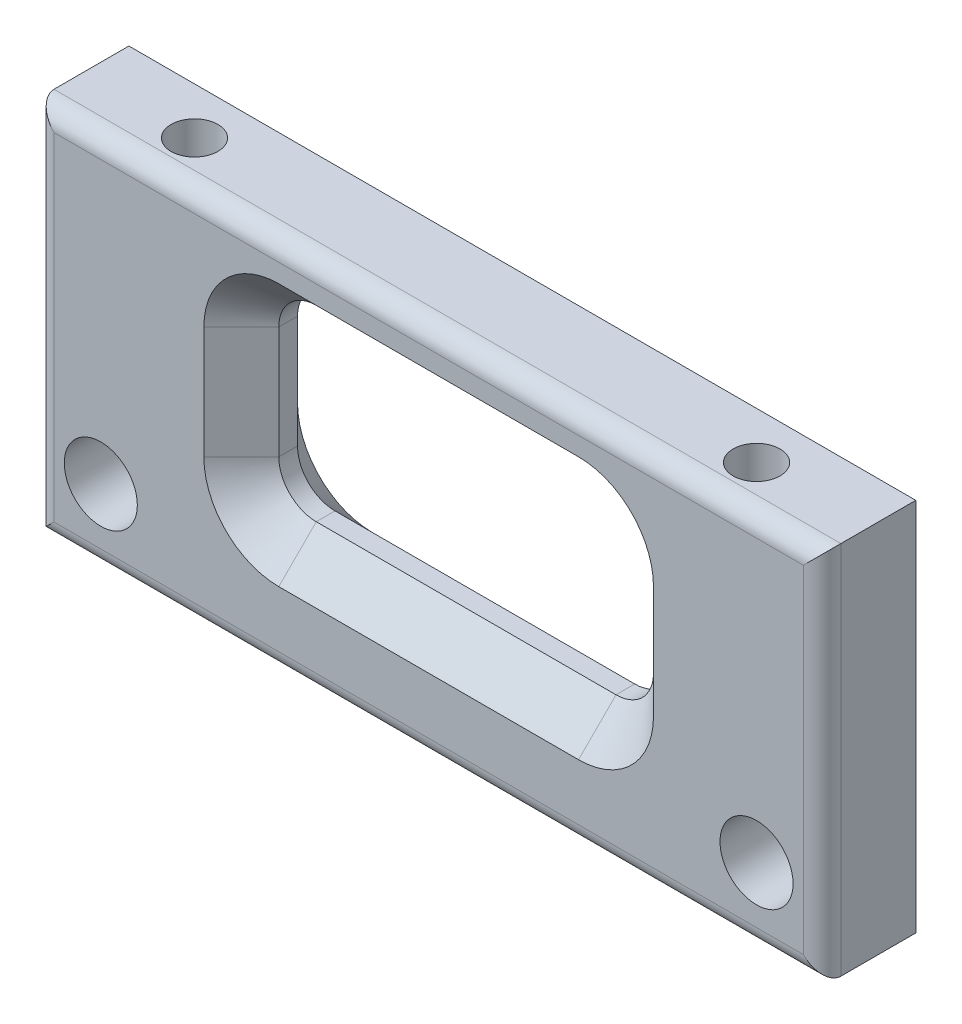
ISO-10303-21;
HEADER;
FILE_DESCRIPTION(('STEP AP214'),'2;1');
FILE_NAME('part.step','',(''),(''),'','','');
FILE_SCHEMA(('AUTOMOTIVE_DESIGN { 1 0 10303 214 1 1 1 1 }'));
ENDSEC;
DATA;
#1=APPLICATION_CONTEXT('core data for automotive mechanical design processes');
#2=APPLICATION_PROTOCOL_DEFINITION('international standard','automotive_design',2000,#1);
#3=PRODUCT_CONTEXT('',#1,'mechanical');
#4=PRODUCT('Part','Part','',(#3));
#5=PRODUCT_RELATED_PRODUCT_CATEGORY('part','',(#4));
#6=PRODUCT_DEFINITION_FORMATION('','',#4);
#7=PRODUCT_DEFINITION_CONTEXT('part definition',#1,'design');
#8=PRODUCT_DEFINITION('design','',#6,#7);
#9=PRODUCT_DEFINITION_SHAPE('','',#8);
#10=(LENGTH_UNIT() NAMED_UNIT(*) SI_UNIT(.MILLI.,.METRE.));
#11=(NAMED_UNIT(*) PLANE_ANGLE_UNIT() SI_UNIT($,.RADIAN.));
#12=(NAMED_UNIT(*) SI_UNIT($,.STERADIAN.) SOLID_ANGLE_UNIT());
#13=UNCERTAINTY_MEASURE_WITH_UNIT(LENGTH_MEASURE(1.E-05),#10,'distance_accuracy_value','');
#14=(GEOMETRIC_REPRESENTATION_CONTEXT(3) GLOBAL_UNCERTAINTY_ASSIGNED_CONTEXT((#13)) GLOBAL_UNIT_ASSIGNED_CONTEXT((#10,
#11,#12)) REPRESENTATION_CONTEXT('',''));
#15=CARTESIAN_POINT('',(0.,0.,0.));
#16=DIRECTION('',(0.,0.,1.));
#17=DIRECTION('',(1.,0.,0.));
#18=AXIS2_PLACEMENT_3D('',#15,#16,#17);
#19=CARTESIAN_POINT('',(0.,0.,5.));
#20=DIRECTION('',(0.,0.,1.));
#21=DIRECTION('',(1.,0.,0.));
#22=AXIS2_PLACEMENT_3D('',#19,#20,#21);
#23=PLANE('',#22);
#24=CARTESIAN_POINT('',(13.,-5.9903461742617,5.));
#25=DIRECTION('',(0.,0.,1.));
#26=DIRECTION('',(1.,0.,0.));
#27=AXIS2_PLACEMENT_3D('',#24,#25,#26);
#28=CIRCLE('',#27,4.00000000000001);
#29=CARTESIAN_POINT('',(8.99999999999999,-5.99034617426173,5.));
#30=VERTEX_POINT('',#29);
#31=CARTESIAN_POINT('',(13.,-1.99034617426169,5.));
#32=VERTEX_POINT('',#31);
#33=EDGE_CURVE('E50',#30,#32,#28,.F.);
#34=ORIENTED_EDGE('',*,*,#33,.T.);
#35=DIRECTION('',(1.,0.,0.));
#36=VECTOR('',#35,1.);
#37=CARTESIAN_POINT('',(29.,-1.99034617426169,5.));
#38=LINE('',#37,#36);
#39=CARTESIAN_POINT('',(29.,-1.99034617426169,5.));
#40=VERTEX_POINT('',#39);
#41=EDGE_CURVE('E11',#32,#40,#38,.T.);
#42=ORIENTED_EDGE('',*,*,#41,.T.);
#43=CARTESIAN_POINT('',(29.,-5.9903461742617,5.));
#44=DIRECTION('',(0.,0.,1.));
#45=DIRECTION('',(1.,0.,0.));
#46=AXIS2_PLACEMENT_3D('',#43,#44,#45);
#47=CIRCLE('',#46,4.00000000000001);
#48=CARTESIAN_POINT('',(33.,-5.99034617426172,5.));
#49=VERTEX_POINT('',#48);
#50=EDGE_CURVE('E322',#40,#49,#47,.F.);
#51=ORIENTED_EDGE('',*,*,#50,.T.);
#52=DIRECTION('',(0.,-1.,0.));
#53=VECTOR('',#52,1.);
#54=CARTESIAN_POINT('',(33.,-11.9903461742617,5.));
#55=LINE('',#54,#53);
#56=CARTESIAN_POINT('',(33.,-11.9903461742617,5.));
#57=VERTEX_POINT('',#56);
#58=EDGE_CURVE('E318',#49,#57,#55,.T.);
#59=ORIENTED_EDGE('',*,*,#58,.T.);
#60=CARTESIAN_POINT('',(29.,-11.9903461742617,5.));
#61=DIRECTION('',(0.,0.,1.));
#62=DIRECTION('',(1.,0.,0.));
#63=AXIS2_PLACEMENT_3D('',#60,#61,#62);
#64=CIRCLE('',#63,4.00000000000001);
#65=CARTESIAN_POINT('',(29.,-15.9903461742617,5.));
#66=VERTEX_POINT('',#65);
#67=EDGE_CURVE('E314',#57,#66,#64,.F.);
#68=ORIENTED_EDGE('',*,*,#67,.T.);
#69=DIRECTION('',(-1.,0.,0.));
#70=VECTOR('',#69,1.);
#71=CARTESIAN_POINT('',(13.,-15.9903461742617,5.));
#72=LINE('',#71,#70);
#73=CARTESIAN_POINT('',(13.,-15.9903461742617,5.));
#74=VERTEX_POINT('',#73);
#75=EDGE_CURVE('E312',#66,#74,#72,.T.);
#76=ORIENTED_EDGE('',*,*,#75,.T.);
#77=CARTESIAN_POINT('',(13.,-11.9903461742617,5.));
#78=DIRECTION('',(0.,0.,1.));
#79=DIRECTION('',(1.,0.,0.));
#80=AXIS2_PLACEMENT_3D('',#77,#78,#79);
#81=CIRCLE('',#80,4.00000000000001);
#82=CARTESIAN_POINT('',(8.99999999999999,-11.9903461742617,5.));
#83=VERTEX_POINT('',#82);
#84=EDGE_CURVE('E316',#74,#83,#81,.F.);
#85=ORIENTED_EDGE('',*,*,#84,.T.);
#86=DIRECTION('',(0.,1.,0.));
#87=VECTOR('',#86,1.);
#88=CARTESIAN_POINT('',(8.99999999999999,-5.99034617426171,5.));
#89=LINE('',#88,#87);
#90=EDGE_CURVE('E320',#83,#30,#89,.T.);
#91=ORIENTED_EDGE('',*,*,#90,.T.);
#92=EDGE_LOOP('',(#34,#42,#51,#59,#68,#76,#85,#91));
#93=FACE_BOUND('',#92,.T.);
#94=DIRECTION('',(1.,0.,0.));
#95=VECTOR('',#94,1.);
#96=CARTESIAN_POINT('',(42.,-19.,5.));
#97=LINE('',#96,#95);
#98=CARTESIAN_POINT('',(1.,-19.,5.));
#99=VERTEX_POINT('',#98);
#100=CARTESIAN_POINT('',(41.,-19.,5.));
#101=VERTEX_POINT('',#100);
#102=EDGE_CURVE('E203',#99,#101,#97,.T.);
#103=ORIENTED_EDGE('',*,*,#102,.T.);
#104=DIRECTION('',(0.,1.,0.));
#105=VECTOR('',#104,1.);
#106=CARTESIAN_POINT('',(41.,0.,5.));
#107=LINE('',#106,#105);
#108=CARTESIAN_POINT('',(41.,-1.,5.));
#109=VERTEX_POINT('',#108);
#110=EDGE_CURVE('E238',#101,#109,#107,.T.);
#111=ORIENTED_EDGE('',*,*,#110,.T.);
#112=DIRECTION('',(-1.,0.,0.));
#113=VECTOR('',#112,1.);
#114=CARTESIAN_POINT('',(0.,-1.,5.));
#115=LINE('',#114,#113);
#116=CARTESIAN_POINT('',(1.,-1.,5.));
#117=VERTEX_POINT('',#116);
#118=EDGE_CURVE('E236',#109,#117,#115,.T.);
#119=ORIENTED_EDGE('',*,*,#118,.T.);
#120=DIRECTION('',(0.,-1.,0.));
#121=VECTOR('',#120,1.);
#122=CARTESIAN_POINT('',(1.,-20.,5.));
#123=LINE('',#122,#121);
#124=EDGE_CURVE('E234',#117,#99,#123,.T.);
#125=ORIENTED_EDGE('',*,*,#124,.T.);
#126=EDGE_LOOP('',(#103,#111,#119,#125));
#127=FACE_BOUND('',#126,.T.);
#128=CARTESIAN_POINT('',(3.5,-16.,5.));
#129=DIRECTION('',(0.,0.,1.));
#130=DIRECTION('',(1.,0.,0.));
#131=AXIS2_PLACEMENT_3D('',#128,#129,#130);
#132=CIRCLE('',#131,1.95);
#133=CARTESIAN_POINT('',(5.45,-16.,5.));
#134=VERTEX_POINT('',#133);
#135=EDGE_CURVE('E219',#134,#134,#132,.T.);
#136=ORIENTED_EDGE('',*,*,#135,.F.);
#137=EDGE_LOOP('',(#136));
#138=FACE_BOUND('',#137,.T.);
#139=CARTESIAN_POINT('',(38.5,-16.,5.));
#140=DIRECTION('',(0.,0.,1.));
#141=DIRECTION('',(1.,0.,0.));
#142=AXIS2_PLACEMENT_3D('',#139,#140,#141);
#143=CIRCLE('',#142,1.95);
#144=CARTESIAN_POINT('',(40.45,-16.,5.));
#145=VERTEX_POINT('',#144);
#146=EDGE_CURVE('E428',#145,#145,#143,.T.);
#147=ORIENTED_EDGE('',*,*,#146,.F.);
#148=EDGE_LOOP('',(#147));
#149=FACE_BOUND('',#148,.T.);
#150=ADVANCED_FACE('F40',(#93,#127,#138,#149),#23,.T.);
#151=CARTESIAN_POINT('',(0.,0.,0.));
#152=DIRECTION('',(0.,0.,1.));
#153=DIRECTION('',(1.,0.,0.));
#154=AXIS2_PLACEMENT_3D('',#151,#152,#153);
#155=PLANE('',#154);
#156=CARTESIAN_POINT('',(29.,-5.9903461742617,0.));
#157=DIRECTION('',(0.,0.,1.));
#158=DIRECTION('',(1.,0.,0.));
#159=AXIS2_PLACEMENT_3D('',#156,#157,#158);
#160=CIRCLE('',#159,3.99999999999999);
#161=CARTESIAN_POINT('',(33.,-5.99034617426172,0.));
#162=VERTEX_POINT('',#161);
#163=CARTESIAN_POINT('',(29.,-1.9903461742617,0.));
#164=VERTEX_POINT('',#163);
#165=EDGE_CURVE('E271',#162,#164,#160,.T.);
#166=ORIENTED_EDGE('',*,*,#165,.T.);
#167=DIRECTION('',(-1.,0.,0.));
#168=VECTOR('',#167,1.);
#169=CARTESIAN_POINT('',(0.,-1.9903461742617,0.));
#170=LINE('',#169,#168);
#171=CARTESIAN_POINT('',(13.,-1.9903461742617,0.));
#172=VERTEX_POINT('',#171);
#173=EDGE_CURVE('E275',#164,#172,#170,.T.);
#174=ORIENTED_EDGE('',*,*,#173,.T.);
#175=CARTESIAN_POINT('',(13.,-5.9903461742617,0.));
#176=DIRECTION('',(0.,0.,1.));
#177=DIRECTION('',(1.,0.,0.));
#178=AXIS2_PLACEMENT_3D('',#175,#176,#177);
#179=CIRCLE('',#178,3.99999999999999);
#180=CARTESIAN_POINT('',(9.00000000000001,-5.99034617426173,0.));
#181=VERTEX_POINT('',#180);
#182=EDGE_CURVE('E273',#172,#181,#179,.T.);
#183=ORIENTED_EDGE('',*,*,#182,.T.);
#184=DIRECTION('',(0.,-1.,0.));
#185=VECTOR('',#184,1.);
#186=CARTESIAN_POINT('',(9.00000000000001,0.,0.));
#187=LINE('',#186,#185);
#188=CARTESIAN_POINT('',(9.,-11.9903461742617,0.));
#189=VERTEX_POINT('',#188);
#190=EDGE_CURVE('E269',#181,#189,#187,.T.);
#191=ORIENTED_EDGE('',*,*,#190,.T.);
#192=CARTESIAN_POINT('',(13.,-11.9903461742617,0.));
#193=DIRECTION('',(0.,0.,1.));
#194=DIRECTION('',(1.,0.,0.));
#195=AXIS2_PLACEMENT_3D('',#192,#193,#194);
#196=CIRCLE('',#195,4.);
#197=CARTESIAN_POINT('',(13.,-15.9903461742617,0.));
#198=VERTEX_POINT('',#197);
#199=EDGE_CURVE('E265',#189,#198,#196,.T.);
#200=ORIENTED_EDGE('',*,*,#199,.T.);
#201=DIRECTION('',(1.,0.,0.));
#202=VECTOR('',#201,1.);
#203=CARTESIAN_POINT('',(0.,-15.9903461742617,0.));
#204=LINE('',#203,#202);
#205=CARTESIAN_POINT('',(29.,-15.9903461742617,0.));
#206=VERTEX_POINT('',#205);
#207=EDGE_CURVE('E249',#198,#206,#204,.T.);
#208=ORIENTED_EDGE('',*,*,#207,.T.);
#209=CARTESIAN_POINT('',(29.,-11.9903461742617,0.));
#210=DIRECTION('',(0.,0.,1.));
#211=DIRECTION('',(1.,0.,0.));
#212=AXIS2_PLACEMENT_3D('',#209,#210,#211);
#213=CIRCLE('',#212,4.);
#214=CARTESIAN_POINT('',(33.,-11.9903461742617,0.));
#215=VERTEX_POINT('',#214);
#216=EDGE_CURVE('E263',#206,#215,#213,.T.);
#217=ORIENTED_EDGE('',*,*,#216,.T.);
#218=DIRECTION('',(0.,1.,0.));
#219=VECTOR('',#218,1.);
#220=CARTESIAN_POINT('',(33.,0.,0.));
#221=LINE('',#220,#219);
#222=EDGE_CURVE('E267',#215,#162,#221,.T.);
#223=ORIENTED_EDGE('',*,*,#222,.T.);
#224=EDGE_LOOP('',(#166,#174,#183,#191,#200,#208,#217,#223));
#225=FACE_BOUND('',#224,.T.);
#226=DIRECTION('',(0.,-1.,0.));
#227=VECTOR('',#226,1.);
#228=CARTESIAN_POINT('',(0.,0.,0.));
#229=LINE('',#228,#227);
#230=CARTESIAN_POINT('',(0.,0.,0.));
#231=VERTEX_POINT('',#230);
#232=CARTESIAN_POINT('',(0.,-20.,0.));
#233=VERTEX_POINT('',#232);
#234=EDGE_CURVE('E211',#231,#233,#229,.T.);
#235=ORIENTED_EDGE('',*,*,#234,.F.);
#236=DIRECTION('',(-1.,0.,0.));
#237=VECTOR('',#236,1.);
#238=CARTESIAN_POINT('',(0.,0.,0.));
#239=LINE('',#238,#237);
#240=CARTESIAN_POINT('',(42.,0.,0.));
#241=VERTEX_POINT('',#240);
#242=EDGE_CURVE('E227',#241,#231,#239,.T.);
#243=ORIENTED_EDGE('',*,*,#242,.F.);
#244=DIRECTION('',(0.,1.,0.));
#245=VECTOR('',#244,1.);
#246=CARTESIAN_POINT('',(42.,0.,0.));
#247=LINE('',#246,#245);
#248=CARTESIAN_POINT('',(42.,-20.,0.));
#249=VERTEX_POINT('',#248);
#250=EDGE_CURVE('E213',#249,#241,#247,.T.);
#251=ORIENTED_EDGE('',*,*,#250,.F.);
#252=DIRECTION('',(1.,0.,0.));
#253=VECTOR('',#252,1.);
#254=CARTESIAN_POINT('',(0.,-20.,0.));
#255=LINE('',#254,#253);
#256=EDGE_CURVE('E196',#233,#249,#255,.T.);
#257=ORIENTED_EDGE('',*,*,#256,.F.);
#258=EDGE_LOOP('',(#235,#243,#251,#257));
#259=FACE_BOUND('',#258,.T.);
#260=CARTESIAN_POINT('',(3.5,-16.,0.));
#261=DIRECTION('',(0.,0.,1.));
#262=DIRECTION('',(1.,0.,0.));
#263=AXIS2_PLACEMENT_3D('',#260,#261,#262);
#264=CIRCLE('',#263,1.95);
#265=CARTESIAN_POINT('',(5.45,-16.,0.));
#266=VERTEX_POINT('',#265);
#267=EDGE_CURVE('E222',#266,#266,#264,.T.);
#268=ORIENTED_EDGE('',*,*,#267,.T.);
#269=EDGE_LOOP('',(#268));
#270=FACE_BOUND('',#269,.T.);
#271=CARTESIAN_POINT('',(38.5,-16.,0.));
#272=DIRECTION('',(0.,0.,1.));
#273=DIRECTION('',(1.,0.,0.));
#274=AXIS2_PLACEMENT_3D('',#271,#272,#273);
#275=CIRCLE('',#274,1.95);
#276=CARTESIAN_POINT('',(40.45,-16.,0.));
#277=VERTEX_POINT('',#276);
#278=EDGE_CURVE('E417',#277,#277,#275,.T.);
#279=ORIENTED_EDGE('',*,*,#278,.T.);
#280=EDGE_LOOP('',(#279));
#281=FACE_BOUND('',#280,.T.);
#282=ADVANCED_FACE('F208',(#225,#259,#270,#281),#155,.F.);
#283=CARTESIAN_POINT('',(0.,0.,5.));
#284=DIRECTION('',(1.,0.,0.));
#285=DIRECTION('',(0.,1.,0.));
#286=AXIS2_PLACEMENT_3D('',#283,#284,#285);
#287=PLANE('',#286);
#288=DIRECTION('',(0.,0.,-1.));
#289=VECTOR('',#288,1.);
#290=CARTESIAN_POINT('',(0.,-20.,5.));
#291=LINE('',#290,#289);
#292=CARTESIAN_POINT('',(0.,-20.,4.));
#293=VERTEX_POINT('',#292);
#294=EDGE_CURVE('E192',#293,#233,#291,.T.);
#295=ORIENTED_EDGE('',*,*,#294,.F.);
#296=DIRECTION('',(0.,-1.,0.));
#297=VECTOR('',#296,1.);
#298=CARTESIAN_POINT('',(0.,0.,4.));
#299=LINE('',#298,#297);
#300=CARTESIAN_POINT('',(0.,0.,4.));
#301=VERTEX_POINT('',#300);
#302=EDGE_CURVE('E246',#293,#301,#299,.F.);
#303=ORIENTED_EDGE('',*,*,#302,.T.);
#304=DIRECTION('',(0.,0.,-1.));
#305=VECTOR('',#304,1.);
#306=CARTESIAN_POINT('',(0.,0.,5.));
#307=LINE('',#306,#305);
#308=EDGE_CURVE('E217',#301,#231,#307,.T.);
#309=ORIENTED_EDGE('',*,*,#308,.T.);
#310=ORIENTED_EDGE('',*,*,#234,.T.);
#311=EDGE_LOOP('',(#295,#303,#309,#310));
#312=FACE_BOUND('',#311,.T.);
#313=ADVANCED_FACE('F215',(#312),#287,.F.);
#314=CARTESIAN_POINT('',(0.,-20.,5.));
#315=DIRECTION('',(0.,1.,0.));
#316=DIRECTION('',(0.,0.,1.));
#317=AXIS2_PLACEMENT_3D('',#314,#315,#316);
#318=PLANE('',#317);
#319=DIRECTION('',(0.,0.,-1.));
#320=VECTOR('',#319,1.);
#321=CARTESIAN_POINT('',(42.,-20.,5.));
#322=LINE('',#321,#320);
#323=CARTESIAN_POINT('',(42.,-20.,4.));
#324=VERTEX_POINT('',#323);
#325=EDGE_CURVE('E204',#324,#249,#322,.T.);
#326=ORIENTED_EDGE('',*,*,#325,.F.);
#327=DIRECTION('',(1.,0.,0.));
#328=VECTOR('',#327,1.);
#329=CARTESIAN_POINT('',(0.,-20.,4.));
#330=LINE('',#329,#328);
#331=EDGE_CURVE('E199',#324,#293,#330,.F.);
#332=ORIENTED_EDGE('',*,*,#331,.T.);
#333=ORIENTED_EDGE('',*,*,#294,.T.);
#334=ORIENTED_EDGE('',*,*,#256,.T.);
#335=EDGE_LOOP('',(#326,#332,#333,#334));
#336=FACE_BOUND('',#335,.T.);
#337=ADVANCED_FACE('F195',(#336),#318,.F.);
#338=CARTESIAN_POINT('',(42.,0.,5.));
#339=DIRECTION('',(-1.,0.,0.));
#340=DIRECTION('',(0.,0.,1.));
#341=AXIS2_PLACEMENT_3D('',#338,#339,#340);
#342=PLANE('',#341);
#343=DIRECTION('',(0.,0.,-1.));
#344=VECTOR('',#343,1.);
#345=CARTESIAN_POINT('',(42.,0.,5.));
#346=LINE('',#345,#344);
#347=CARTESIAN_POINT('',(42.,0.,4.));
#348=VERTEX_POINT('',#347);
#349=EDGE_CURVE('E230',#348,#241,#346,.T.);
#350=ORIENTED_EDGE('',*,*,#349,.F.);
#351=DIRECTION('',(0.,1.,0.));
#352=VECTOR('',#351,1.);
#353=CARTESIAN_POINT('',(42.,-20.,4.));
#354=LINE('',#353,#352);
#355=EDGE_CURVE('E241',#348,#324,#354,.F.);
#356=ORIENTED_EDGE('',*,*,#355,.T.);
#357=ORIENTED_EDGE('',*,*,#325,.T.);
#358=ORIENTED_EDGE('',*,*,#250,.T.);
#359=EDGE_LOOP('',(#350,#356,#357,#358));
#360=FACE_BOUND('',#359,.T.);
#361=ADVANCED_FACE('F462',(#360),#342,.F.);
#362=CARTESIAN_POINT('',(0.,0.,5.));
#363=DIRECTION('',(0.,-1.,0.));
#364=DIRECTION('',(0.,0.,-1.));
#365=AXIS2_PLACEMENT_3D('',#362,#363,#364);
#366=PLANE('',#365);
#367=CARTESIAN_POINT('',(36.,0.,2.5));
#368=DIRECTION('',(0.,1.,0.));
#369=DIRECTION('',(0.,0.,1.));
#370=AXIS2_PLACEMENT_3D('',#367,#368,#369);
#371=CIRCLE('',#370,1.25);
#372=CARTESIAN_POINT('',(36.,0.,3.75));
#373=VERTEX_POINT('',#372);
#374=EDGE_CURVE('E418',#373,#373,#371,.T.);
#375=ORIENTED_EDGE('',*,*,#374,.F.);
#376=EDGE_LOOP('',(#375));
#377=FACE_BOUND('',#376,.T.);
#378=CARTESIAN_POINT('',(6.,0.,2.5));
#379=DIRECTION('',(0.,1.,0.));
#380=DIRECTION('',(0.,0.,1.));
#381=AXIS2_PLACEMENT_3D('',#378,#379,#380);
#382=CIRCLE('',#381,1.25);
#383=CARTESIAN_POINT('',(6.,0.,3.75));
#384=VERTEX_POINT('',#383);
#385=EDGE_CURVE('E421',#384,#384,#382,.T.);
#386=ORIENTED_EDGE('',*,*,#385,.F.);
#387=EDGE_LOOP('',(#386));
#388=FACE_BOUND('',#387,.T.);
#389=ORIENTED_EDGE('',*,*,#308,.F.);
#390=DIRECTION('',(-1.,0.,0.));
#391=VECTOR('',#390,1.);
#392=CARTESIAN_POINT('',(42.,0.,4.));
#393=LINE('',#392,#391);
#394=EDGE_CURVE('E244',#301,#348,#393,.F.);
#395=ORIENTED_EDGE('',*,*,#394,.T.);
#396=ORIENTED_EDGE('',*,*,#349,.T.);
#397=ORIENTED_EDGE('',*,*,#242,.T.);
#398=EDGE_LOOP('',(#389,#395,#396,#397));
#399=FACE_BOUND('',#398,.T.);
#400=ADVANCED_FACE('F448',(#377,#388,#399),#366,.F.);
#401=CARTESIAN_POINT('',(3.5,-16.,5.));
#402=DIRECTION('',(0.,0.,-1.));
#403=DIRECTION('',(-1.,0.,0.));
#404=AXIS2_PLACEMENT_3D('',#401,#402,#403);
#405=CYLINDRICAL_SURFACE('',#404,1.95);
#406=ORIENTED_EDGE('',*,*,#135,.T.);
#407=EDGE_LOOP('',(#406));
#408=FACE_BOUND('',#407,.T.);
#409=ORIENTED_EDGE('',*,*,#267,.F.);
#410=EDGE_LOOP('',(#409));
#411=FACE_BOUND('',#410,.T.);
#412=ADVANCED_FACE('F438',(#408,#411),#405,.F.);
#413=CARTESIAN_POINT('',(38.5,-16.,5.));
#414=DIRECTION('',(0.,0.,-1.));
#415=DIRECTION('',(-1.,0.,0.));
#416=AXIS2_PLACEMENT_3D('',#413,#414,#415);
#417=CYLINDRICAL_SURFACE('',#416,1.95);
#418=ORIENTED_EDGE('',*,*,#146,.T.);
#419=EDGE_LOOP('',(#418));
#420=FACE_BOUND('',#419,.T.);
#421=ORIENTED_EDGE('',*,*,#278,.F.);
#422=EDGE_LOOP('',(#421));
#423=FACE_BOUND('',#422,.T.);
#424=ADVANCED_FACE('F435',(#420,#423),#417,.F.);
#425=CARTESIAN_POINT('',(6.,-10.,2.5));
#426=DIRECTION('',(0.,1.,0.));
#427=DIRECTION('',(0.,0.,1.));
#428=AXIS2_PLACEMENT_3D('',#425,#426,#427);
#429=CYLINDRICAL_SURFACE('',#428,1.25);
#430=CARTESIAN_POINT('',(6.,-10.,2.5));
#431=DIRECTION('',(0.,1.,0.));
#432=DIRECTION('',(0.,0.,1.));
#433=AXIS2_PLACEMENT_3D('',#430,#431,#432);
#434=CIRCLE('',#433,1.25);
#435=CARTESIAN_POINT('',(6.,-10.,3.75));
#436=VERTEX_POINT('',#435);
#437=EDGE_CURVE('E424',#436,#436,#434,.T.);
#438=ORIENTED_EDGE('',*,*,#437,.F.);
#439=EDGE_LOOP('',(#438));
#440=FACE_BOUND('',#439,.T.);
#441=ORIENTED_EDGE('',*,*,#385,.T.);
#442=EDGE_LOOP('',(#441));
#443=FACE_BOUND('',#442,.T.);
#444=ADVANCED_FACE('F437',(#440,#443),#429,.F.);
#445=CARTESIAN_POINT('',(6.,-10.,2.5));
#446=DIRECTION('',(0.,1.,0.));
#447=DIRECTION('',(0.,0.,1.));
#448=AXIS2_PLACEMENT_3D('',#445,#446,#447);
#449=PLANE('',#448);
#450=ORIENTED_EDGE('',*,*,#437,.T.);
#451=EDGE_LOOP('',(#450));
#452=FACE_BOUND('',#451,.T.);
#453=ADVANCED_FACE('F445',(#452),#449,.T.);
#454=CARTESIAN_POINT('',(36.,-10.,2.5));
#455=DIRECTION('',(0.,1.,0.));
#456=DIRECTION('',(0.,0.,1.));
#457=AXIS2_PLACEMENT_3D('',#454,#455,#456);
#458=CYLINDRICAL_SURFACE('',#457,1.25);
#459=CARTESIAN_POINT('',(36.,-10.,2.5));
#460=DIRECTION('',(0.,1.,0.));
#461=DIRECTION('',(0.,0.,1.));
#462=AXIS2_PLACEMENT_3D('',#459,#460,#461);
#463=CIRCLE('',#462,1.25);
#464=CARTESIAN_POINT('',(36.,-10.,3.75));
#465=VERTEX_POINT('',#464);
#466=EDGE_CURVE('E414',#465,#465,#463,.T.);
#467=ORIENTED_EDGE('',*,*,#466,.F.);
#468=EDGE_LOOP('',(#467));
#469=FACE_BOUND('',#468,.T.);
#470=ORIENTED_EDGE('',*,*,#374,.T.);
#471=EDGE_LOOP('',(#470));
#472=FACE_BOUND('',#471,.T.);
#473=ADVANCED_FACE('F704',(#469,#472),#458,.F.);
#474=CARTESIAN_POINT('',(36.,-10.,2.5));
#475=DIRECTION('',(0.,1.,0.));
#476=DIRECTION('',(0.,0.,1.));
#477=AXIS2_PLACEMENT_3D('',#474,#475,#476);
#478=PLANE('',#477);
#479=ORIENTED_EDGE('',*,*,#466,.T.);
#480=EDGE_LOOP('',(#479));
#481=FACE_BOUND('',#480,.T.);
#482=ADVANCED_FACE('F695',(#481),#478,.T.);
#483=CARTESIAN_POINT('',(13.,-11.9903461742617,-5.));
#484=DIRECTION('',(0.,0.,1.));
#485=DIRECTION('',(1.,0.,0.));
#486=AXIS2_PLACEMENT_3D('',#483,#484,#485);
#487=CYLINDRICAL_SURFACE('',#486,2.);
#488=DIRECTION('',(0.,0.,1.));
#489=VECTOR('',#488,1.);
#490=CARTESIAN_POINT('',(13.,-13.9903461742617,-5.));
#491=LINE('',#490,#489);
#492=CARTESIAN_POINT('',(13.,-13.9903461742617,2.00000000000001));
#493=VERTEX_POINT('',#492);
#494=CARTESIAN_POINT('',(13.,-13.9903461742617,3.00000000000001));
#495=VERTEX_POINT('',#494);
#496=EDGE_CURVE('E261',#493,#495,#491,.T.);
#497=ORIENTED_EDGE('',*,*,#496,.F.);
#498=CARTESIAN_POINT('',(13.,-11.9903461742617,2.00000000000001));
#499=DIRECTION('',(0.,0.,1.));
#500=DIRECTION('',(1.,0.,0.));
#501=AXIS2_PLACEMENT_3D('',#498,#499,#500);
#502=CIRCLE('',#501,2.);
#503=CARTESIAN_POINT('',(11.,-11.9903461742617,2.00000000000001));
#504=VERTEX_POINT('',#503);
#505=EDGE_CURVE('E302',#493,#504,#502,.F.);
#506=ORIENTED_EDGE('',*,*,#505,.T.);
#507=DIRECTION('',(0.,0.,1.));
#508=VECTOR('',#507,1.);
#509=CARTESIAN_POINT('',(11.,-11.9903461742617,-5.));
#510=LINE('',#509,#508);
#511=CARTESIAN_POINT('',(11.,-11.9903461742617,3.00000000000001));
#512=VERTEX_POINT('',#511);
#513=EDGE_CURVE('E427',#504,#512,#510,.T.);
#514=ORIENTED_EDGE('',*,*,#513,.T.);
#515=CARTESIAN_POINT('',(13.,-11.9903461742617,3.00000000000001));
#516=DIRECTION('',(0.,0.,1.));
#517=DIRECTION('',(1.,0.,0.));
#518=AXIS2_PLACEMENT_3D('',#515,#516,#517);
#519=CIRCLE('',#518,2.);
#520=EDGE_CURVE('E300',#512,#495,#519,.T.);
#521=ORIENTED_EDGE('',*,*,#520,.T.);
#522=EDGE_LOOP('',(#497,#506,#514,#521));
#523=FACE_BOUND('',#522,.T.);
#524=ADVANCED_FACE('F687',(#523),#487,.F.);
#525=CARTESIAN_POINT('',(11.,-11.9903461742617,-5.));
#526=DIRECTION('',(-1.,0.,0.));
#527=DIRECTION('',(0.,0.,1.));
#528=AXIS2_PLACEMENT_3D('',#525,#526,#527);
#529=PLANE('',#528);
#530=ORIENTED_EDGE('',*,*,#513,.F.);
#531=DIRECTION('',(0.,1.,0.));
#532=VECTOR('',#531,1.);
#533=CARTESIAN_POINT('',(11.,-11.9903461742617,2.00000000000001));
#534=LINE('',#533,#532);
#535=CARTESIAN_POINT('',(11.,-5.99034617426171,2.00000000000001));
#536=VERTEX_POINT('',#535);
#537=EDGE_CURVE('E294',#504,#536,#534,.T.);
#538=ORIENTED_EDGE('',*,*,#537,.T.);
#539=DIRECTION('',(0.,0.,1.));
#540=VECTOR('',#539,1.);
#541=CARTESIAN_POINT('',(11.,-5.99034617426171,-5.));
#542=LINE('',#541,#540);
#543=CARTESIAN_POINT('',(11.,-5.99034617426171,3.00000000000001));
#544=VERTEX_POINT('',#543);
#545=EDGE_CURVE('E401',#536,#544,#542,.T.);
#546=ORIENTED_EDGE('',*,*,#545,.T.);
#547=DIRECTION('',(0.,-1.,0.));
#548=VECTOR('',#547,1.);
#549=CARTESIAN_POINT('',(11.,-11.9903461742617,3.00000000000001));
#550=LINE('',#549,#548);
#551=EDGE_CURVE('E292',#544,#512,#550,.T.);
#552=ORIENTED_EDGE('',*,*,#551,.T.);
#553=EDGE_LOOP('',(#530,#538,#546,#552));
#554=FACE_BOUND('',#553,.T.);
#555=ADVANCED_FACE('F679',(#554),#529,.F.);
#556=CARTESIAN_POINT('',(13.,-5.9903461742617,-5.));
#557=DIRECTION('',(0.,0.,1.));
#558=DIRECTION('',(1.,0.,0.));
#559=AXIS2_PLACEMENT_3D('',#556,#557,#558);
#560=CYLINDRICAL_SURFACE('',#559,2.);
#561=ORIENTED_EDGE('',*,*,#545,.F.);
#562=CARTESIAN_POINT('',(13.,-5.9903461742617,2.00000000000001));
#563=DIRECTION('',(0.,0.,1.));
#564=DIRECTION('',(1.,0.,0.));
#565=AXIS2_PLACEMENT_3D('',#562,#563,#564);
#566=CIRCLE('',#565,2.);
#567=CARTESIAN_POINT('',(13.,-3.9903461742617,2.00000000000001));
#568=VERTEX_POINT('',#567);
#569=EDGE_CURVE('E286',#536,#568,#566,.F.);
#570=ORIENTED_EDGE('',*,*,#569,.T.);
#571=DIRECTION('',(0.,0.,1.));
#572=VECTOR('',#571,1.);
#573=CARTESIAN_POINT('',(13.,-3.9903461742617,-5.));
#574=LINE('',#573,#572);
#575=CARTESIAN_POINT('',(13.,-3.9903461742617,3.00000000000001));
#576=VERTEX_POINT('',#575);
#577=EDGE_CURVE('E399',#568,#576,#574,.T.);
#578=ORIENTED_EDGE('',*,*,#577,.T.);
#579=CARTESIAN_POINT('',(13.,-5.9903461742617,3.00000000000001));
#580=DIRECTION('',(0.,0.,1.));
#581=DIRECTION('',(1.,0.,0.));
#582=AXIS2_PLACEMENT_3D('',#579,#580,#581);
#583=CIRCLE('',#582,2.);
#584=EDGE_CURVE('E284',#576,#544,#583,.T.);
#585=ORIENTED_EDGE('',*,*,#584,.T.);
#586=EDGE_LOOP('',(#561,#570,#578,#585));
#587=FACE_BOUND('',#586,.T.);
#588=ADVANCED_FACE('F672',(#587),#560,.F.);
#589=CARTESIAN_POINT('',(29.,-3.9903461742617,-5.));
#590=DIRECTION('',(0.,1.,0.));
#591=DIRECTION('',(-1.,0.,0.));
#592=AXIS2_PLACEMENT_3D('',#589,#590,#591);
#593=PLANE('',#592);
#594=ORIENTED_EDGE('',*,*,#577,.F.);
#595=DIRECTION('',(1.,0.,0.));
#596=VECTOR('',#595,1.);
#597=CARTESIAN_POINT('',(29.,-3.9903461742617,2.00000000000001));
#598=LINE('',#597,#596);
#599=CARTESIAN_POINT('',(29.,-3.9903461742617,2.00000000000001));
#600=VERTEX_POINT('',#599);
#601=EDGE_CURVE('E281',#568,#600,#598,.T.);
#602=ORIENTED_EDGE('',*,*,#601,.T.);
#603=DIRECTION('',(0.,0.,1.));
#604=VECTOR('',#603,1.);
#605=CARTESIAN_POINT('',(29.,-3.9903461742617,-5.));
#606=LINE('',#605,#604);
#607=CARTESIAN_POINT('',(29.,-3.9903461742617,3.00000000000001));
#608=VERTEX_POINT('',#607);
#609=EDGE_CURVE('E391',#600,#608,#606,.T.);
#610=ORIENTED_EDGE('',*,*,#609,.T.);
#611=DIRECTION('',(-1.,0.,0.));
#612=VECTOR('',#611,1.);
#613=CARTESIAN_POINT('',(13.,-3.9903461742617,3.00000000000001));
#614=LINE('',#613,#612);
#615=EDGE_CURVE('E278',#608,#576,#614,.T.);
#616=ORIENTED_EDGE('',*,*,#615,.T.);
#617=EDGE_LOOP('',(#594,#602,#610,#616));
#618=FACE_BOUND('',#617,.T.);
#619=ADVANCED_FACE('F396',(#618),#593,.F.);
#620=CARTESIAN_POINT('',(29.,-5.9903461742617,-5.));
#621=DIRECTION('',(0.,0.,1.));
#622=DIRECTION('',(1.,0.,0.));
#623=AXIS2_PLACEMENT_3D('',#620,#621,#622);
#624=CYLINDRICAL_SURFACE('',#623,2.);
#625=ORIENTED_EDGE('',*,*,#609,.F.);
#626=CARTESIAN_POINT('',(29.,-5.9903461742617,2.00000000000001));
#627=DIRECTION('',(0.,0.,1.));
#628=DIRECTION('',(1.,0.,0.));
#629=AXIS2_PLACEMENT_3D('',#626,#627,#628);
#630=CIRCLE('',#629,2.);
#631=CARTESIAN_POINT('',(31.,-5.99034617426171,2.00000000000001));
#632=VERTEX_POINT('',#631);
#633=EDGE_CURVE('E290',#600,#632,#630,.F.);
#634=ORIENTED_EDGE('',*,*,#633,.T.);
#635=DIRECTION('',(0.,0.,1.));
#636=VECTOR('',#635,1.);
#637=CARTESIAN_POINT('',(31.,-5.99034617426171,-5.));
#638=LINE('',#637,#636);
#639=CARTESIAN_POINT('',(31.,-5.99034617426171,3.00000000000001));
#640=VERTEX_POINT('',#639);
#641=EDGE_CURVE('E393',#632,#640,#638,.T.);
#642=ORIENTED_EDGE('',*,*,#641,.T.);
#643=CARTESIAN_POINT('',(29.,-5.9903461742617,3.00000000000001));
#644=DIRECTION('',(0.,0.,1.));
#645=DIRECTION('',(1.,0.,0.));
#646=AXIS2_PLACEMENT_3D('',#643,#644,#645);
#647=CIRCLE('',#646,2.);
#648=EDGE_CURVE('E288',#640,#608,#647,.T.);
#649=ORIENTED_EDGE('',*,*,#648,.T.);
#650=EDGE_LOOP('',(#625,#634,#642,#649));
#651=FACE_BOUND('',#650,.T.);
#652=ADVANCED_FACE('F390',(#651),#624,.F.);
#653=CARTESIAN_POINT('',(31.,-11.9903461742617,-5.));
#654=DIRECTION('',(1.,0.,0.));
#655=DIRECTION('',(0.,0.,-1.));
#656=AXIS2_PLACEMENT_3D('',#653,#654,#655);
#657=PLANE('',#656);
#658=ORIENTED_EDGE('',*,*,#641,.F.);
#659=DIRECTION('',(0.,-1.,0.));
#660=VECTOR('',#659,1.);
#661=CARTESIAN_POINT('',(31.,-11.9903461742617,2.00000000000001));
#662=LINE('',#661,#660);
#663=CARTESIAN_POINT('',(31.,-11.9903461742617,2.00000000000001));
#664=VERTEX_POINT('',#663);
#665=EDGE_CURVE('E298',#632,#664,#662,.T.);
#666=ORIENTED_EDGE('',*,*,#665,.T.);
#667=DIRECTION('',(0.,0.,1.));
#668=VECTOR('',#667,1.);
#669=CARTESIAN_POINT('',(31.,-11.9903461742617,-5.));
#670=LINE('',#669,#668);
#671=CARTESIAN_POINT('',(31.,-11.9903461742617,3.00000000000001));
#672=VERTEX_POINT('',#671);
#673=EDGE_CURVE('E403',#664,#672,#670,.T.);
#674=ORIENTED_EDGE('',*,*,#673,.T.);
#675=DIRECTION('',(0.,1.,0.));
#676=VECTOR('',#675,1.);
#677=CARTESIAN_POINT('',(31.,-5.99034617426171,3.00000000000001));
#678=LINE('',#677,#676);
#679=EDGE_CURVE('E296',#672,#640,#678,.T.);
#680=ORIENTED_EDGE('',*,*,#679,.T.);
#681=EDGE_LOOP('',(#658,#666,#674,#680));
#682=FACE_BOUND('',#681,.T.);
#683=ADVANCED_FACE('F651',(#682),#657,.F.);
#684=CARTESIAN_POINT('',(29.,-11.9903461742617,-5.));
#685=DIRECTION('',(0.,0.,1.));
#686=DIRECTION('',(1.,0.,0.));
#687=AXIS2_PLACEMENT_3D('',#684,#685,#686);
#688=CYLINDRICAL_SURFACE('',#687,2.);
#689=ORIENTED_EDGE('',*,*,#673,.F.);
#690=CARTESIAN_POINT('',(29.,-11.9903461742617,2.00000000000001));
#691=DIRECTION('',(0.,0.,1.));
#692=DIRECTION('',(1.,0.,0.));
#693=AXIS2_PLACEMENT_3D('',#690,#691,#692);
#694=CIRCLE('',#693,2.);
#695=CARTESIAN_POINT('',(29.,-13.9903461742617,2.00000000000001));
#696=VERTEX_POINT('',#695);
#697=EDGE_CURVE('E306',#664,#696,#694,.F.);
#698=ORIENTED_EDGE('',*,*,#697,.T.);
#699=DIRECTION('',(0.,0.,1.));
#700=VECTOR('',#699,1.);
#701=CARTESIAN_POINT('',(29.,-13.9903461742617,-5.));
#702=LINE('',#701,#700);
#703=CARTESIAN_POINT('',(29.,-13.9903461742617,3.00000000000001));
#704=VERTEX_POINT('',#703);
#705=EDGE_CURVE('E409',#696,#704,#702,.T.);
#706=ORIENTED_EDGE('',*,*,#705,.T.);
#707=CARTESIAN_POINT('',(29.,-11.9903461742617,3.00000000000001));
#708=DIRECTION('',(0.,0.,1.));
#709=DIRECTION('',(1.,0.,0.));
#710=AXIS2_PLACEMENT_3D('',#707,#708,#709);
#711=CIRCLE('',#710,2.);
#712=EDGE_CURVE('E304',#704,#672,#711,.T.);
#713=ORIENTED_EDGE('',*,*,#712,.T.);
#714=EDGE_LOOP('',(#689,#698,#706,#713));
#715=FACE_BOUND('',#714,.T.);
#716=ADVANCED_FACE('F643',(#715),#688,.F.);
#717=CARTESIAN_POINT('',(29.,-13.9903461742617,-5.));
#718=DIRECTION('',(0.,-1.,0.));
#719=DIRECTION('',(1.,0.,0.));
#720=AXIS2_PLACEMENT_3D('',#717,#718,#719);
#721=PLANE('',#720);
#722=ORIENTED_EDGE('',*,*,#705,.F.);
#723=DIRECTION('',(-1.,0.,0.));
#724=VECTOR('',#723,1.);
#725=CARTESIAN_POINT('',(29.,-13.9903461742617,2.00000000000001));
#726=LINE('',#725,#724);
#727=EDGE_CURVE('E310',#696,#493,#726,.T.);
#728=ORIENTED_EDGE('',*,*,#727,.T.);
#729=ORIENTED_EDGE('',*,*,#496,.T.);
#730=DIRECTION('',(1.,0.,0.));
#731=VECTOR('',#730,1.);
#732=CARTESIAN_POINT('',(29.,-13.9903461742617,3.00000000000001));
#733=LINE('',#732,#731);
#734=EDGE_CURVE('E308',#495,#704,#733,.T.);
#735=ORIENTED_EDGE('',*,*,#734,.T.);
#736=EDGE_LOOP('',(#722,#728,#729,#735));
#737=FACE_BOUND('',#736,.T.);
#738=ADVANCED_FACE('F487',(#737),#721,.F.);
#739=CARTESIAN_POINT('',(1.,0.,4.));
#740=DIRECTION('',(0.,1.,0.));
#741=DIRECTION('',(-1.,0.,0.));
#742=AXIS2_PLACEMENT_3D('',#739,#740,#741);
#743=CYLINDRICAL_SURFACE('',#742,1.);
#744=CARTESIAN_POINT('',(1.,-1.,4.));
#745=DIRECTION('',(0.707106781186547,0.707106781186548,0.));
#746=DIRECTION('',(-0.707106781186548,0.707106781186547,0.));
#747=AXIS2_PLACEMENT_3D('',#744,#745,#746);
#748=ELLIPSE('',#747,1.4142135623731,1.);
#749=EDGE_CURVE('E255',#301,#117,#748,.T.);
#750=ORIENTED_EDGE('',*,*,#749,.F.);
#751=ORIENTED_EDGE('',*,*,#302,.F.);
#752=CARTESIAN_POINT('',(1.,-19.,4.));
#753=DIRECTION('',(-0.707106781186548,0.707106781186547,0.));
#754=DIRECTION('',(-0.707106781186547,-0.707106781186548,0.));
#755=AXIS2_PLACEMENT_3D('',#752,#753,#754);
#756=ELLIPSE('',#755,1.41421356237309,1.);
#757=EDGE_CURVE('E258',#99,#293,#756,.F.);
#758=ORIENTED_EDGE('',*,*,#757,.F.);
#759=ORIENTED_EDGE('',*,*,#124,.F.);
#760=EDGE_LOOP('',(#750,#751,#758,#759));
#761=FACE_BOUND('',#760,.T.);
#762=ADVANCED_FACE('F483',(#761),#743,.T.);
#763=CARTESIAN_POINT('',(0.,-19.,4.));
#764=DIRECTION('',(-1.,0.,0.));
#765=DIRECTION('',(0.,0.,1.));
#766=AXIS2_PLACEMENT_3D('',#763,#764,#765);
#767=CYLINDRICAL_SURFACE('',#766,1.);
#768=ORIENTED_EDGE('',*,*,#757,.T.);
#769=ORIENTED_EDGE('',*,*,#331,.F.);
#770=CARTESIAN_POINT('',(41.,-19.,4.));
#771=DIRECTION('',(-0.707106781186547,-0.707106781186547,0.));
#772=DIRECTION('',(-0.707106781186547,0.707106781186547,0.));
#773=AXIS2_PLACEMENT_3D('',#770,#771,#772);
#774=ELLIPSE('',#773,1.41421356237309,1.);
#775=EDGE_CURVE('E252',#101,#324,#774,.F.);
#776=ORIENTED_EDGE('',*,*,#775,.F.);
#777=ORIENTED_EDGE('',*,*,#102,.F.);
#778=EDGE_LOOP('',(#768,#769,#776,#777));
#779=FACE_BOUND('',#778,.T.);
#780=ADVANCED_FACE('F479',(#779),#767,.T.);
#781=CARTESIAN_POINT('',(0.,-1.,4.));
#782=DIRECTION('',(1.,0.,0.));
#783=DIRECTION('',(0.,0.,-1.));
#784=AXIS2_PLACEMENT_3D('',#781,#782,#783);
#785=CYLINDRICAL_SURFACE('',#784,1.);
#786=ORIENTED_EDGE('',*,*,#749,.T.);
#787=ORIENTED_EDGE('',*,*,#118,.F.);
#788=CARTESIAN_POINT('',(41.,-1.,4.));
#789=DIRECTION('',(0.707106781186547,-0.707106781186547,0.));
#790=DIRECTION('',(0.707106781186547,0.707106781186547,0.));
#791=AXIS2_PLACEMENT_3D('',#788,#789,#790);
#792=ELLIPSE('',#791,1.41421356237309,1.);
#793=EDGE_CURVE('E250',#348,#109,#792,.T.);
#794=ORIENTED_EDGE('',*,*,#793,.F.);
#795=ORIENTED_EDGE('',*,*,#394,.F.);
#796=EDGE_LOOP('',(#786,#787,#794,#795));
#797=FACE_BOUND('',#796,.T.);
#798=ADVANCED_FACE('F475',(#797),#785,.T.);
#799=CARTESIAN_POINT('',(41.,0.,4.));
#800=DIRECTION('',(0.,-1.,0.));
#801=DIRECTION('',(0.,0.,-1.));
#802=AXIS2_PLACEMENT_3D('',#799,#800,#801);
#803=CYLINDRICAL_SURFACE('',#802,1.);
#804=ORIENTED_EDGE('',*,*,#775,.T.);
#805=ORIENTED_EDGE('',*,*,#355,.F.);
#806=ORIENTED_EDGE('',*,*,#793,.T.);
#807=ORIENTED_EDGE('',*,*,#110,.F.);
#808=EDGE_LOOP('',(#804,#805,#806,#807));
#809=FACE_BOUND('',#808,.T.);
#810=ADVANCED_FACE('F471',(#809),#803,.T.);
#811=CARTESIAN_POINT('',(0.,-15.9903461742617,0.));
#812=DIRECTION('',(0.,-0.70710678118655,0.707106781186545));
#813=DIRECTION('',(1.,0.,0.));
#814=AXIS2_PLACEMENT_3D('',#811,#812,#813);
#815=PLANE('',#814);
#816=DIRECTION('',(0.,-0.707106781186545,-0.70710678118655));
#817=VECTOR('',#816,1.);
#818=CARTESIAN_POINT('',(13.,-13.9903461742617,2.00000000000001));
#819=LINE('',#818,#817);
#820=EDGE_CURVE('E341',#493,#198,#819,.T.);
#821=ORIENTED_EDGE('',*,*,#820,.F.);
#822=ORIENTED_EDGE('',*,*,#727,.F.);
#823=DIRECTION('',(0.,0.707106781186545,0.70710678118655));
#824=VECTOR('',#823,1.);
#825=CARTESIAN_POINT('',(29.,-15.9903461742617,0.));
#826=LINE('',#825,#824);
#827=EDGE_CURVE('E253',#206,#696,#826,.T.);
#828=ORIENTED_EDGE('',*,*,#827,.F.);
#829=ORIENTED_EDGE('',*,*,#207,.F.);
#830=EDGE_LOOP('',(#821,#822,#828,#829));
#831=FACE_BOUND('',#830,.T.);
#832=ADVANCED_FACE('F474',(#831),#815,.F.);
#833=CARTESIAN_POINT('',(29.,-11.9903461742617,0.));
#834=DIRECTION('',(0.,0.,-1.));
#835=DIRECTION('',(-1.,0.,0.));
#836=AXIS2_PLACEMENT_3D('',#833,#834,#835);
#837=CONICAL_SURFACE('',#836,3.99999999999999,0.785398163397445);
#838=ORIENTED_EDGE('',*,*,#827,.T.);
#839=ORIENTED_EDGE('',*,*,#697,.F.);
#840=DIRECTION('',(-0.707106781186545,0.,0.70710678118655));
#841=VECTOR('',#840,1.);
#842=CARTESIAN_POINT('',(33.,-11.9903461742617,0.));
#843=LINE('',#842,#841);
#844=EDGE_CURVE('E338',#215,#664,#843,.T.);
#845=ORIENTED_EDGE('',*,*,#844,.F.);
#846=ORIENTED_EDGE('',*,*,#216,.F.);
#847=EDGE_LOOP('',(#838,#839,#845,#846));
#848=FACE_BOUND('',#847,.T.);
#849=ADVANCED_FACE('F531',(#848),#837,.F.);
#850=CARTESIAN_POINT('',(13.,-11.9903461742617,0.));
#851=DIRECTION('',(0.,0.,-1.));
#852=DIRECTION('',(-1.,0.,0.));
#853=AXIS2_PLACEMENT_3D('',#850,#851,#852);
#854=CONICAL_SURFACE('',#853,3.99999999999999,0.785398163397445);
#855=ORIENTED_EDGE('',*,*,#820,.T.);
#856=ORIENTED_EDGE('',*,*,#199,.F.);
#857=DIRECTION('',(-0.707106781186545,0.,-0.70710678118655));
#858=VECTOR('',#857,1.);
#859=CARTESIAN_POINT('',(11.,-11.9903461742617,2.00000000000001));
#860=LINE('',#859,#858);
#861=EDGE_CURVE('E335',#504,#189,#860,.T.);
#862=ORIENTED_EDGE('',*,*,#861,.F.);
#863=ORIENTED_EDGE('',*,*,#505,.F.);
#864=EDGE_LOOP('',(#855,#856,#862,#863));
#865=FACE_BOUND('',#864,.T.);
#866=ADVANCED_FACE('F524',(#865),#854,.F.);
#867=CARTESIAN_POINT('',(33.,0.,0.));
#868=DIRECTION('',(0.70710678118655,0.,0.707106781186545));
#869=DIRECTION('',(0.,1.,0.));
#870=AXIS2_PLACEMENT_3D('',#867,#868,#869);
#871=PLANE('',#870);
#872=ORIENTED_EDGE('',*,*,#844,.T.);
#873=ORIENTED_EDGE('',*,*,#665,.F.);
#874=DIRECTION('',(-0.707106781186545,0.,0.70710678118655));
#875=VECTOR('',#874,1.);
#876=CARTESIAN_POINT('',(33.,-5.99034617426172,0.));
#877=LINE('',#876,#875);
#878=EDGE_CURVE('E332',#162,#632,#877,.T.);
#879=ORIENTED_EDGE('',*,*,#878,.F.);
#880=ORIENTED_EDGE('',*,*,#222,.F.);
#881=EDGE_LOOP('',(#872,#873,#879,#880));
#882=FACE_BOUND('',#881,.T.);
#883=ADVANCED_FACE('F517',(#882),#871,.F.);
#884=CARTESIAN_POINT('',(9.00000000000001,0.,0.));
#885=DIRECTION('',(-0.70710678118655,0.,0.707106781186545));
#886=DIRECTION('',(0.,-1.,0.));
#887=AXIS2_PLACEMENT_3D('',#884,#885,#886);
#888=PLANE('',#887);
#889=ORIENTED_EDGE('',*,*,#861,.T.);
#890=ORIENTED_EDGE('',*,*,#190,.F.);
#891=DIRECTION('',(-0.707106781186545,0.,-0.70710678118655));
#892=VECTOR('',#891,1.);
#893=CARTESIAN_POINT('',(11.,-5.99034617426171,2.00000000000001));
#894=LINE('',#893,#892);
#895=EDGE_CURVE('E329',#536,#181,#894,.T.);
#896=ORIENTED_EDGE('',*,*,#895,.F.);
#897=ORIENTED_EDGE('',*,*,#537,.F.);
#898=EDGE_LOOP('',(#889,#890,#896,#897));
#899=FACE_BOUND('',#898,.T.);
#900=ADVANCED_FACE('F510',(#899),#888,.F.);
#901=CARTESIAN_POINT('',(29.,-5.9903461742617,0.));
#902=DIRECTION('',(0.,0.,-1.));
#903=DIRECTION('',(-1.,0.,0.));
#904=AXIS2_PLACEMENT_3D('',#901,#902,#903);
#905=CONICAL_SURFACE('',#904,3.99999999999999,0.785398163397445);
#906=ORIENTED_EDGE('',*,*,#878,.T.);
#907=ORIENTED_EDGE('',*,*,#633,.F.);
#908=DIRECTION('',(0.,-0.707106781186545,0.70710678118655));
#909=VECTOR('',#908,1.);
#910=CARTESIAN_POINT('',(29.,-1.9903461742617,0.));
#911=LINE('',#910,#909);
#912=EDGE_CURVE('E327',#164,#600,#911,.T.);
#913=ORIENTED_EDGE('',*,*,#912,.F.);
#914=ORIENTED_EDGE('',*,*,#165,.F.);
#915=EDGE_LOOP('',(#906,#907,#913,#914));
#916=FACE_BOUND('',#915,.T.);
#917=ADVANCED_FACE('F503',(#916),#905,.F.);
#918=CARTESIAN_POINT('',(13.,-5.9903461742617,0.));
#919=DIRECTION('',(0.,0.,-1.));
#920=DIRECTION('',(-1.,0.,0.));
#921=AXIS2_PLACEMENT_3D('',#918,#919,#920);
#922=CONICAL_SURFACE('',#921,3.99999999999999,0.785398163397445);
#923=ORIENTED_EDGE('',*,*,#895,.T.);
#924=ORIENTED_EDGE('',*,*,#182,.F.);
#925=DIRECTION('',(0.,0.707106781186545,-0.70710678118655));
#926=VECTOR('',#925,1.);
#927=CARTESIAN_POINT('',(13.,-3.9903461742617,2.00000000000001));
#928=LINE('',#927,#926);
#929=EDGE_CURVE('E325',#568,#172,#928,.T.);
#930=ORIENTED_EDGE('',*,*,#929,.F.);
#931=ORIENTED_EDGE('',*,*,#569,.F.);
#932=EDGE_LOOP('',(#923,#924,#930,#931));
#933=FACE_BOUND('',#932,.T.);
#934=ADVANCED_FACE('F496',(#933),#922,.F.);
#935=CARTESIAN_POINT('',(0.,-1.9903461742617,0.));
#936=DIRECTION('',(0.,0.70710678118655,0.707106781186545));
#937=DIRECTION('',(-1.,0.,0.));
#938=AXIS2_PLACEMENT_3D('',#935,#936,#937);
#939=PLANE('',#938);
#940=ORIENTED_EDGE('',*,*,#912,.T.);
#941=ORIENTED_EDGE('',*,*,#601,.F.);
#942=ORIENTED_EDGE('',*,*,#929,.T.);
#943=ORIENTED_EDGE('',*,*,#173,.F.);
#944=EDGE_LOOP('',(#940,#941,#942,#943));
#945=FACE_BOUND('',#944,.T.);
#946=ADVANCED_FACE('F490',(#945),#939,.F.);
#947=CARTESIAN_POINT('',(29.,-13.9903461742617,3.00000000000001));
#948=DIRECTION('',(0.,0.707106781186545,0.70710678118655));
#949=DIRECTION('',(-1.,0.,0.));
#950=AXIS2_PLACEMENT_3D('',#947,#948,#949);
#951=PLANE('',#950);
#952=DIRECTION('',(0.,0.70710678118655,-0.707106781186545));
#953=VECTOR('',#952,1.);
#954=CARTESIAN_POINT('',(13.,-15.9903461742617,5.));
#955=LINE('',#954,#953);
#956=EDGE_CURVE('E360',#74,#495,#955,.T.);
#957=ORIENTED_EDGE('',*,*,#956,.F.);
#958=ORIENTED_EDGE('',*,*,#75,.F.);
#959=DIRECTION('',(0.,-0.70710678118655,0.707106781186544));
#960=VECTOR('',#959,1.);
#961=CARTESIAN_POINT('',(29.,-13.9903461742617,3.00000000000001));
#962=LINE('',#961,#960);
#963=EDGE_CURVE('E45',#704,#66,#962,.T.);
#964=ORIENTED_EDGE('',*,*,#963,.F.);
#965=ORIENTED_EDGE('',*,*,#734,.F.);
#966=EDGE_LOOP('',(#957,#958,#964,#965));
#967=FACE_BOUND('',#966,.T.);
#968=ADVANCED_FACE('F43',(#967),#951,.T.);
#969=CARTESIAN_POINT('',(29.,-11.9903461742617,3.00000000000001));
#970=DIRECTION('',(0.,0.,1.));
#971=DIRECTION('',(1.,0.,0.));
#972=AXIS2_PLACEMENT_3D('',#969,#970,#971);
#973=CONICAL_SURFACE('',#972,2.,0.785398163397452);
#974=ORIENTED_EDGE('',*,*,#963,.T.);
#975=ORIENTED_EDGE('',*,*,#67,.F.);
#976=DIRECTION('',(0.70710678118655,0.,0.707106781186545));
#977=VECTOR('',#976,1.);
#978=CARTESIAN_POINT('',(31.,-11.9903461742617,3.00000000000001));
#979=LINE('',#978,#977);
#980=EDGE_CURVE('E358',#672,#57,#979,.T.);
#981=ORIENTED_EDGE('',*,*,#980,.F.);
#982=ORIENTED_EDGE('',*,*,#712,.F.);
#983=EDGE_LOOP('',(#974,#975,#981,#982));
#984=FACE_BOUND('',#983,.T.);
#985=ADVANCED_FACE('F371',(#984),#973,.F.);
#986=CARTESIAN_POINT('',(13.,-11.9903461742617,3.00000000000001));
#987=DIRECTION('',(0.,0.,1.));
#988=DIRECTION('',(1.,0.,0.));
#989=AXIS2_PLACEMENT_3D('',#986,#987,#988);
#990=CONICAL_SURFACE('',#989,2.,0.785398163397451);
#991=ORIENTED_EDGE('',*,*,#956,.T.);
#992=ORIENTED_EDGE('',*,*,#520,.F.);
#993=DIRECTION('',(0.70710678118655,0.,-0.707106781186545));
#994=VECTOR('',#993,1.);
#995=CARTESIAN_POINT('',(8.99999999999999,-11.9903461742617,5.));
#996=LINE('',#995,#994);
#997=EDGE_CURVE('E355',#83,#512,#996,.T.);
#998=ORIENTED_EDGE('',*,*,#997,.F.);
#999=ORIENTED_EDGE('',*,*,#84,.F.);
#1000=EDGE_LOOP('',(#991,#992,#998,#999));
#1001=FACE_BOUND('',#1000,.T.);
#1002=ADVANCED_FACE('F575',(#1001),#990,.F.);
#1003=CARTESIAN_POINT('',(31.,-11.9903461742617,3.00000000000001));
#1004=DIRECTION('',(-0.707106781186545,0.,0.70710678118655));
#1005=DIRECTION('',(0.,-1.,0.));
#1006=AXIS2_PLACEMENT_3D('',#1003,#1004,#1005);
#1007=PLANE('',#1006);
#1008=ORIENTED_EDGE('',*,*,#980,.T.);
#1009=ORIENTED_EDGE('',*,*,#58,.F.);
#1010=DIRECTION('',(0.70710678118655,0.,0.707106781186545));
#1011=VECTOR('',#1010,1.);
#1012=CARTESIAN_POINT('',(31.,-5.99034617426171,3.00000000000001));
#1013=LINE('',#1012,#1011);
#1014=EDGE_CURVE('E352',#640,#49,#1013,.T.);
#1015=ORIENTED_EDGE('',*,*,#1014,.F.);
#1016=ORIENTED_EDGE('',*,*,#679,.F.);
#1017=EDGE_LOOP('',(#1008,#1009,#1015,#1016));
#1018=FACE_BOUND('',#1017,.T.);
#1019=ADVANCED_FACE('F381',(#1018),#1007,.T.);
#1020=CARTESIAN_POINT('',(11.,-11.9903461742617,3.00000000000001));
#1021=DIRECTION('',(0.707106781186545,0.,0.70710678118655));
#1022=DIRECTION('',(0.,1.,0.));
#1023=AXIS2_PLACEMENT_3D('',#1020,#1021,#1022);
#1024=PLANE('',#1023);
#1025=ORIENTED_EDGE('',*,*,#997,.T.);
#1026=ORIENTED_EDGE('',*,*,#551,.F.);
#1027=DIRECTION('',(0.70710678118655,0.,-0.707106781186545));
#1028=VECTOR('',#1027,1.);
#1029=CARTESIAN_POINT('',(8.99999999999999,-5.99034617426173,5.));
#1030=LINE('',#1029,#1028);
#1031=EDGE_CURVE('E349',#30,#544,#1030,.T.);
#1032=ORIENTED_EDGE('',*,*,#1031,.F.);
#1033=ORIENTED_EDGE('',*,*,#90,.F.);
#1034=EDGE_LOOP('',(#1025,#1026,#1032,#1033));
#1035=FACE_BOUND('',#1034,.T.);
#1036=ADVANCED_FACE('F563',(#1035),#1024,.T.);
#1037=CARTESIAN_POINT('',(29.,-5.9903461742617,3.00000000000001));
#1038=DIRECTION('',(0.,0.,1.));
#1039=DIRECTION('',(1.,0.,0.));
#1040=AXIS2_PLACEMENT_3D('',#1037,#1038,#1039);
#1041=CONICAL_SURFACE('',#1040,2.,0.785398163397452);
#1042=ORIENTED_EDGE('',*,*,#1014,.T.);
#1043=ORIENTED_EDGE('',*,*,#50,.F.);
#1044=DIRECTION('',(0.,0.70710678118655,0.707106781186545));
#1045=VECTOR('',#1044,1.);
#1046=CARTESIAN_POINT('',(29.,-3.9903461742617,3.00000000000001));
#1047=LINE('',#1046,#1045);
#1048=EDGE_CURVE('E63',#608,#40,#1047,.T.);
#1049=ORIENTED_EDGE('',*,*,#1048,.F.);
#1050=ORIENTED_EDGE('',*,*,#648,.F.);
#1051=EDGE_LOOP('',(#1042,#1043,#1049,#1050));
#1052=FACE_BOUND('',#1051,.T.);
#1053=ADVANCED_FACE('F385',(#1052),#1041,.F.);
#1054=CARTESIAN_POINT('',(13.,-5.9903461742617,3.00000000000001));
#1055=DIRECTION('',(0.,0.,1.));
#1056=DIRECTION('',(1.,0.,0.));
#1057=AXIS2_PLACEMENT_3D('',#1054,#1055,#1056);
#1058=CONICAL_SURFACE('',#1057,2.,0.785398163397452);
#1059=ORIENTED_EDGE('',*,*,#1031,.T.);
#1060=ORIENTED_EDGE('',*,*,#584,.F.);
#1061=DIRECTION('',(0.,-0.70710678118655,-0.707106781186545));
#1062=VECTOR('',#1061,1.);
#1063=CARTESIAN_POINT('',(13.,-1.99034617426169,5.));
#1064=LINE('',#1063,#1062);
#1065=EDGE_CURVE('E346',#32,#576,#1064,.T.);
#1066=ORIENTED_EDGE('',*,*,#1065,.F.);
#1067=ORIENTED_EDGE('',*,*,#33,.F.);
#1068=EDGE_LOOP('',(#1059,#1060,#1066,#1067));
#1069=FACE_BOUND('',#1068,.T.);
#1070=ADVANCED_FACE('F551',(#1069),#1058,.F.);
#1071=CARTESIAN_POINT('',(29.,-3.9903461742617,3.00000000000001));
#1072=DIRECTION('',(0.,-0.707106781186545,0.70710678118655));
#1073=DIRECTION('',(1.,0.,0.));
#1074=AXIS2_PLACEMENT_3D('',#1071,#1072,#1073);
#1075=PLANE('',#1074);
#1076=ORIENTED_EDGE('',*,*,#1048,.T.);
#1077=ORIENTED_EDGE('',*,*,#41,.F.);
#1078=ORIENTED_EDGE('',*,*,#1065,.T.);
#1079=ORIENTED_EDGE('',*,*,#615,.F.);
#1080=EDGE_LOOP('',(#1076,#1077,#1078,#1079));
#1081=FACE_BOUND('',#1080,.T.);
#1082=ADVANCED_FACE('F545',(#1081),#1075,.T.);
#1083=CLOSED_SHELL('',(#150,#282,#313,#337,#361,#400,#412,#424,#444,#453,#473,#482,#524,#555,
#588,#619,#652,#683,#716,#738,#762,#780,#798,#810,#832,#849,#866,#883,#900,#917,#934,#946,#968,
#985,#1002,#1019,#1036,#1053,#1070,#1082));
#1084=MANIFOLD_SOLID_BREP('B2',#1083);
#1085=ADVANCED_BREP_SHAPE_REPRESENTATION('',(#18,#1084),#14);
#1086=SHAPE_DEFINITION_REPRESENTATION(#9,#1085);
ENDSEC;
END-ISO-10303-21;
